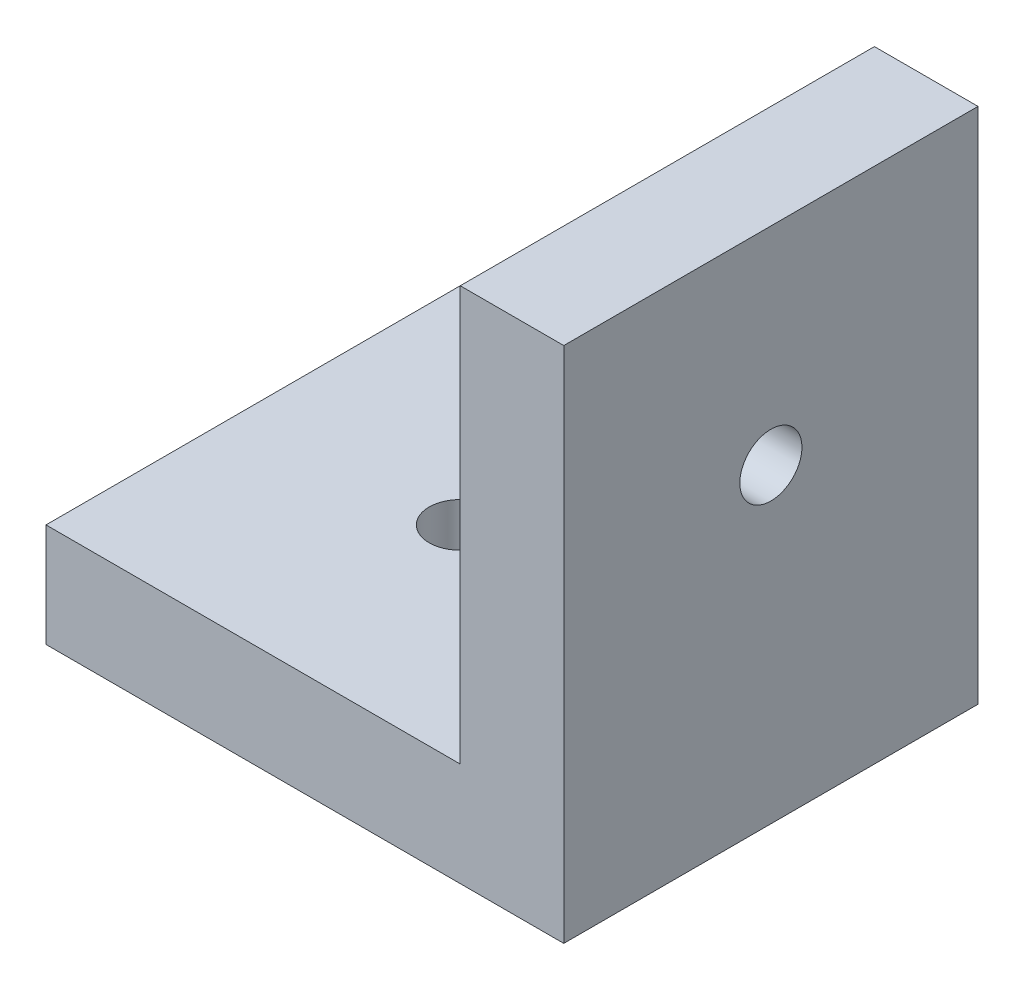
ISO-10303-21;
HEADER;
FILE_DESCRIPTION(('STEP AP214'),'2;1');
FILE_NAME('part.step','',(''),(''),'','','');
FILE_SCHEMA(('AUTOMOTIVE_DESIGN { 1 0 10303 214 1 1 1 1 }'));
ENDSEC;
DATA;
#1=APPLICATION_CONTEXT('core data for automotive mechanical design processes');
#2=APPLICATION_PROTOCOL_DEFINITION('international standard','automotive_design',2000,#1);
#3=PRODUCT_CONTEXT('',#1,'mechanical');
#4=PRODUCT('Part','Part','',(#3));
#5=PRODUCT_RELATED_PRODUCT_CATEGORY('part','',(#4));
#6=PRODUCT_DEFINITION_FORMATION('','',#4);
#7=PRODUCT_DEFINITION_CONTEXT('part definition',#1,'design');
#8=PRODUCT_DEFINITION('design','',#6,#7);
#9=PRODUCT_DEFINITION_SHAPE('','',#8);
#10=(LENGTH_UNIT() NAMED_UNIT(*) SI_UNIT(.MILLI.,.METRE.));
#11=(NAMED_UNIT(*) PLANE_ANGLE_UNIT() SI_UNIT($,.RADIAN.));
#12=(NAMED_UNIT(*) SI_UNIT($,.STERADIAN.) SOLID_ANGLE_UNIT());
#13=UNCERTAINTY_MEASURE_WITH_UNIT(LENGTH_MEASURE(1.E-05),#10,'distance_accuracy_value','');
#14=(GEOMETRIC_REPRESENTATION_CONTEXT(3) GLOBAL_UNCERTAINTY_ASSIGNED_CONTEXT((#13)) GLOBAL_UNIT_ASSIGNED_CONTEXT((#10,
#11,#12)) REPRESENTATION_CONTEXT('',''));
#15=CARTESIAN_POINT('',(0.,0.,0.));
#16=DIRECTION('',(0.,0.,1.));
#17=DIRECTION('',(1.,0.,0.));
#18=AXIS2_PLACEMENT_3D('',#15,#16,#17);
#19=CARTESIAN_POINT('',(0.,0.,20.));
#20=DIRECTION('',(1.,0.,0.));
#21=DIRECTION('',(0.,1.,0.));
#22=AXIS2_PLACEMENT_3D('',#19,#20,#21);
#23=PLANE('',#22);
#24=CARTESIAN_POINT('',(0.,-10.,10.));
#25=DIRECTION('',(-1.,0.,0.));
#26=DIRECTION('',(0.,-1.,0.));
#27=AXIS2_PLACEMENT_3D('',#24,#25,#26);
#28=CIRCLE('',#27,1.5);
#29=CARTESIAN_POINT('',(0.,-11.5,10.));
#30=VERTEX_POINT('',#29);
#31=EDGE_CURVE('E167',#30,#30,#28,.T.);
#32=ORIENTED_EDGE('',*,*,#31,.F.);
#33=EDGE_LOOP('',(#32));
#34=FACE_BOUND('',#33,.T.);
#35=DIRECTION('',(0.,-1.,0.));
#36=VECTOR('',#35,1.);
#37=CARTESIAN_POINT('',(0.,0.,0.));
#38=LINE('',#37,#36);
#39=CARTESIAN_POINT('',(0.,0.,0.));
#40=VERTEX_POINT('',#39);
#41=CARTESIAN_POINT('',(0.,-20.,0.));
#42=VERTEX_POINT('',#41);
#43=EDGE_CURVE('E123',#40,#42,#38,.T.);
#44=ORIENTED_EDGE('',*,*,#43,.T.);
#45=DIRECTION('',(0.,0.,-1.));
#46=VECTOR('',#45,1.);
#47=CARTESIAN_POINT('',(0.,-20.,20.));
#48=LINE('',#47,#46);
#49=CARTESIAN_POINT('',(0.,-20.,20.));
#50=VERTEX_POINT('',#49);
#51=EDGE_CURVE('E11',#50,#42,#48,.T.);
#52=ORIENTED_EDGE('',*,*,#51,.F.);
#53=DIRECTION('',(0.,-1.,0.));
#54=VECTOR('',#53,1.);
#55=CARTESIAN_POINT('',(0.,0.,20.));
#56=LINE('',#55,#54);
#57=CARTESIAN_POINT('',(0.,0.,20.));
#58=VERTEX_POINT('',#57);
#59=EDGE_CURVE('E138',#58,#50,#56,.T.);
#60=ORIENTED_EDGE('',*,*,#59,.F.);
#61=DIRECTION('',(0.,0.,-1.));
#62=VECTOR('',#61,1.);
#63=CARTESIAN_POINT('',(0.,0.,20.));
#64=LINE('',#63,#62);
#65=EDGE_CURVE('E55',#58,#40,#64,.T.);
#66=ORIENTED_EDGE('',*,*,#65,.T.);
#67=EDGE_LOOP('',(#44,#52,#60,#66));
#68=FACE_BOUND('',#67,.T.);
#69=ADVANCED_FACE('F39',(#34,#68),#23,.F.);
#70=CARTESIAN_POINT('',(0.,-20.,20.));
#71=DIRECTION('',(0.,-1.,0.));
#72=DIRECTION('',(1.,0.,0.));
#73=AXIS2_PLACEMENT_3D('',#70,#71,#72);
#74=PLANE('',#73);
#75=CARTESIAN_POINT('',(-10.,-20.,10.));
#76=DIRECTION('',(0.,1.,0.));
#77=DIRECTION('',(-1.,0.,0.));
#78=AXIS2_PLACEMENT_3D('',#75,#76,#77);
#79=CIRCLE('',#78,1.5);
#80=CARTESIAN_POINT('',(-11.5,-20.,10.));
#81=VERTEX_POINT('',#80);
#82=EDGE_CURVE('E173',#81,#81,#79,.T.);
#83=ORIENTED_EDGE('',*,*,#82,.F.);
#84=EDGE_LOOP('',(#83));
#85=FACE_BOUND('',#84,.T.);
#86=DIRECTION('',(-1.,0.,0.));
#87=VECTOR('',#86,1.);
#88=CARTESIAN_POINT('',(0.,-20.,0.));
#89=LINE('',#88,#87);
#90=CARTESIAN_POINT('',(-20.,-20.,0.));
#91=VERTEX_POINT('',#90);
#92=EDGE_CURVE('E125',#42,#91,#89,.T.);
#93=ORIENTED_EDGE('',*,*,#92,.T.);
#94=DIRECTION('',(0.,0.,-1.));
#95=VECTOR('',#94,1.);
#96=CARTESIAN_POINT('',(-20.,-20.,20.));
#97=LINE('',#96,#95);
#98=CARTESIAN_POINT('',(-20.,-20.,20.));
#99=VERTEX_POINT('',#98);
#100=EDGE_CURVE('E47',#99,#91,#97,.T.);
#101=ORIENTED_EDGE('',*,*,#100,.F.);
#102=DIRECTION('',(-1.,0.,0.));
#103=VECTOR('',#102,1.);
#104=CARTESIAN_POINT('',(0.,-20.,20.));
#105=LINE('',#104,#103);
#106=EDGE_CURVE('E87',#50,#99,#105,.T.);
#107=ORIENTED_EDGE('',*,*,#106,.F.);
#108=ORIENTED_EDGE('',*,*,#51,.T.);
#109=EDGE_LOOP('',(#93,#101,#107,#108));
#110=FACE_BOUND('',#109,.T.);
#111=ADVANCED_FACE('F144',(#85,#110),#74,.F.);
#112=CARTESIAN_POINT('',(-20.,0.,20.));
#113=DIRECTION('',(-1.,0.,0.));
#114=DIRECTION('',(0.,0.,1.));
#115=AXIS2_PLACEMENT_3D('',#112,#113,#114);
#116=PLANE('',#115);
#117=DIRECTION('',(0.,1.,0.));
#118=VECTOR('',#117,1.);
#119=CARTESIAN_POINT('',(-20.,0.,0.));
#120=LINE('',#119,#118);
#121=CARTESIAN_POINT('',(-20.,-25.,0.));
#122=VERTEX_POINT('',#121);
#123=EDGE_CURVE('E129',#122,#91,#120,.T.);
#124=ORIENTED_EDGE('',*,*,#123,.F.);
#125=DIRECTION('',(0.,0.,-1.));
#126=VECTOR('',#125,1.);
#127=CARTESIAN_POINT('',(-20.,-25.,20.));
#128=LINE('',#127,#126);
#129=CARTESIAN_POINT('',(-20.,-25.,20.));
#130=VERTEX_POINT('',#129);
#131=EDGE_CURVE('E115',#130,#122,#128,.T.);
#132=ORIENTED_EDGE('',*,*,#131,.F.);
#133=DIRECTION('',(0.,1.,0.));
#134=VECTOR('',#133,1.);
#135=CARTESIAN_POINT('',(-20.,0.,20.));
#136=LINE('',#135,#134);
#137=EDGE_CURVE('E105',#130,#99,#136,.T.);
#138=ORIENTED_EDGE('',*,*,#137,.T.);
#139=ORIENTED_EDGE('',*,*,#100,.T.);
#140=EDGE_LOOP('',(#124,#132,#138,#139));
#141=FACE_BOUND('',#140,.T.);
#142=ADVANCED_FACE('F143',(#141),#116,.T.);
#143=CARTESIAN_POINT('',(0.,-25.,20.));
#144=DIRECTION('',(0.,1.,0.));
#145=DIRECTION('',(0.,0.,1.));
#146=AXIS2_PLACEMENT_3D('',#143,#144,#145);
#147=PLANE('',#146);
#148=CARTESIAN_POINT('',(-10.,-25.,10.));
#149=DIRECTION('',(0.,1.,0.));
#150=DIRECTION('',(0.,0.,1.));
#151=AXIS2_PLACEMENT_3D('',#148,#149,#150);
#152=CIRCLE('',#151,1.5);
#153=CARTESIAN_POINT('',(-10.,-25.,11.5));
#154=VERTEX_POINT('',#153);
#155=EDGE_CURVE('E126',#154,#154,#152,.F.);
#156=ORIENTED_EDGE('',*,*,#155,.F.);
#157=EDGE_LOOP('',(#156));
#158=FACE_BOUND('',#157,.T.);
#159=DIRECTION('',(1.,0.,0.));
#160=VECTOR('',#159,1.);
#161=CARTESIAN_POINT('',(0.,-25.,0.));
#162=LINE('',#161,#160);
#163=CARTESIAN_POINT('',(5.,-25.,0.));
#164=VERTEX_POINT('',#163);
#165=EDGE_CURVE('E112',#122,#164,#162,.T.);
#166=ORIENTED_EDGE('',*,*,#165,.T.);
#167=DIRECTION('',(0.,0.,-1.));
#168=VECTOR('',#167,1.);
#169=CARTESIAN_POINT('',(5.,-25.,20.));
#170=LINE('',#169,#168);
#171=CARTESIAN_POINT('',(5.,-25.,20.));
#172=VERTEX_POINT('',#171);
#173=EDGE_CURVE('E109',#172,#164,#170,.T.);
#174=ORIENTED_EDGE('',*,*,#173,.F.);
#175=DIRECTION('',(1.,0.,0.));
#176=VECTOR('',#175,1.);
#177=CARTESIAN_POINT('',(0.,-25.,20.));
#178=LINE('',#177,#176);
#179=EDGE_CURVE('E98',#130,#172,#178,.T.);
#180=ORIENTED_EDGE('',*,*,#179,.F.);
#181=ORIENTED_EDGE('',*,*,#131,.T.);
#182=EDGE_LOOP('',(#166,#174,#180,#181));
#183=FACE_BOUND('',#182,.T.);
#184=ADVANCED_FACE('F110',(#158,#183),#147,.F.);
#185=CARTESIAN_POINT('',(5.,0.,20.));
#186=DIRECTION('',(1.,0.,0.));
#187=DIRECTION('',(0.,1.,0.));
#188=AXIS2_PLACEMENT_3D('',#185,#186,#187);
#189=PLANE('',#188);
#190=CARTESIAN_POINT('',(5.,-10.,10.));
#191=DIRECTION('',(1.,0.,0.));
#192=DIRECTION('',(0.,1.,0.));
#193=AXIS2_PLACEMENT_3D('',#190,#191,#192);
#194=CIRCLE('',#193,1.5);
#195=CARTESIAN_POINT('',(5.,-11.5,10.));
#196=VERTEX_POINT('',#195);
#197=EDGE_CURVE('E176',#196,#196,#194,.F.);
#198=ORIENTED_EDGE('',*,*,#197,.T.);
#199=EDGE_LOOP('',(#198));
#200=FACE_BOUND('',#199,.T.);
#201=DIRECTION('',(0.,-1.,0.));
#202=VECTOR('',#201,1.);
#203=CARTESIAN_POINT('',(5.,0.,0.));
#204=LINE('',#203,#202);
#205=CARTESIAN_POINT('',(5.,0.,0.));
#206=VERTEX_POINT('',#205);
#207=EDGE_CURVE('E133',#206,#164,#204,.T.);
#208=ORIENTED_EDGE('',*,*,#207,.F.);
#209=DIRECTION('',(0.,0.,-1.));
#210=VECTOR('',#209,1.);
#211=CARTESIAN_POINT('',(5.,0.,20.));
#212=LINE('',#211,#210);
#213=CARTESIAN_POINT('',(5.,0.,20.));
#214=VERTEX_POINT('',#213);
#215=EDGE_CURVE('E75',#214,#206,#212,.T.);
#216=ORIENTED_EDGE('',*,*,#215,.F.);
#217=DIRECTION('',(0.,-1.,0.));
#218=VECTOR('',#217,1.);
#219=CARTESIAN_POINT('',(5.,0.,20.));
#220=LINE('',#219,#218);
#221=EDGE_CURVE('E103',#214,#172,#220,.T.);
#222=ORIENTED_EDGE('',*,*,#221,.T.);
#223=ORIENTED_EDGE('',*,*,#173,.T.);
#224=EDGE_LOOP('',(#208,#216,#222,#223));
#225=FACE_BOUND('',#224,.T.);
#226=ADVANCED_FACE('F117',(#200,#225),#189,.T.);
#227=CARTESIAN_POINT('',(0.,0.,20.));
#228=DIRECTION('',(0.,1.,0.));
#229=DIRECTION('',(0.,0.,1.));
#230=AXIS2_PLACEMENT_3D('',#227,#228,#229);
#231=PLANE('',#230);
#232=DIRECTION('',(1.,0.,0.));
#233=VECTOR('',#232,1.);
#234=CARTESIAN_POINT('',(0.,0.,0.));
#235=LINE('',#234,#233);
#236=EDGE_CURVE('E135',#40,#206,#235,.T.);
#237=ORIENTED_EDGE('',*,*,#236,.F.);
#238=ORIENTED_EDGE('',*,*,#65,.F.);
#239=DIRECTION('',(1.,0.,0.));
#240=VECTOR('',#239,1.);
#241=CARTESIAN_POINT('',(0.,0.,20.));
#242=LINE('',#241,#240);
#243=EDGE_CURVE('E118',#58,#214,#242,.T.);
#244=ORIENTED_EDGE('',*,*,#243,.T.);
#245=ORIENTED_EDGE('',*,*,#215,.T.);
#246=EDGE_LOOP('',(#237,#238,#244,#245));
#247=FACE_BOUND('',#246,.T.);
#248=ADVANCED_FACE('F148',(#247),#231,.T.);
#249=CARTESIAN_POINT('',(0.,0.,20.));
#250=DIRECTION('',(0.,0.,1.));
#251=DIRECTION('',(1.,0.,0.));
#252=AXIS2_PLACEMENT_3D('',#249,#250,#251);
#253=PLANE('',#252);
#254=ORIENTED_EDGE('',*,*,#59,.T.);
#255=ORIENTED_EDGE('',*,*,#106,.T.);
#256=ORIENTED_EDGE('',*,*,#137,.F.);
#257=ORIENTED_EDGE('',*,*,#179,.T.);
#258=ORIENTED_EDGE('',*,*,#221,.F.);
#259=ORIENTED_EDGE('',*,*,#243,.F.);
#260=EDGE_LOOP('',(#254,#255,#256,#257,#258,#259));
#261=FACE_BOUND('',#260,.T.);
#262=ADVANCED_FACE('F100',(#261),#253,.T.);
#263=CARTESIAN_POINT('',(0.,0.,0.));
#264=DIRECTION('',(0.,0.,1.));
#265=DIRECTION('',(1.,0.,0.));
#266=AXIS2_PLACEMENT_3D('',#263,#264,#265);
#267=PLANE('',#266);
#268=ORIENTED_EDGE('',*,*,#43,.F.);
#269=ORIENTED_EDGE('',*,*,#236,.T.);
#270=ORIENTED_EDGE('',*,*,#207,.T.);
#271=ORIENTED_EDGE('',*,*,#165,.F.);
#272=ORIENTED_EDGE('',*,*,#123,.T.);
#273=ORIENTED_EDGE('',*,*,#92,.F.);
#274=EDGE_LOOP('',(#268,#269,#270,#271,#272,#273));
#275=FACE_BOUND('',#274,.T.);
#276=ADVANCED_FACE('F147',(#275),#267,.F.);
#277=CARTESIAN_POINT('',(-10.,-25.001,10.));
#278=DIRECTION('',(0.,1.,0.));
#279=DIRECTION('',(-1.,0.,0.));
#280=AXIS2_PLACEMENT_3D('',#277,#278,#279);
#281=CYLINDRICAL_SURFACE('',#280,1.5);
#282=ORIENTED_EDGE('',*,*,#82,.T.);
#283=EDGE_LOOP('',(#282));
#284=FACE_BOUND('',#283,.T.);
#285=ORIENTED_EDGE('',*,*,#155,.T.);
#286=EDGE_LOOP('',(#285));
#287=FACE_BOUND('',#286,.T.);
#288=ADVANCED_FACE('F182',(#284,#287),#281,.F.);
#289=CARTESIAN_POINT('',(5.001,-10.,10.));
#290=DIRECTION('',(-1.,0.,0.));
#291=DIRECTION('',(0.,-1.,0.));
#292=AXIS2_PLACEMENT_3D('',#289,#290,#291);
#293=CYLINDRICAL_SURFACE('',#292,1.5);
#294=CARTESIAN_POINT('',(5.,-11.5,10.));
#295=CARTESIAN_POINT('',(4.94791666666667,-11.5,10.));
#296=CARTESIAN_POINT('',(4.89583333333334,-11.5,10.));
#297=CARTESIAN_POINT('',(4.79166666666667,-11.5,10.));
#298=CARTESIAN_POINT('',(4.73958333333334,-11.5,10.));
#299=CARTESIAN_POINT('',(4.63541666666667,-11.5,10.));
#300=CARTESIAN_POINT('',(4.58333333333334,-11.5,10.));
#301=CARTESIAN_POINT('',(4.47916666666667,-11.5,10.));
#302=CARTESIAN_POINT('',(4.42708333333334,-11.5,10.));
#303=CARTESIAN_POINT('',(4.32291666666667,-11.5,10.));
#304=CARTESIAN_POINT('',(4.27083333333334,-11.5,10.));
#305=CARTESIAN_POINT('',(4.16666666666667,-11.5,10.));
#306=CARTESIAN_POINT('',(4.11458333333334,-11.5,10.));
#307=CARTESIAN_POINT('',(4.01041666666667,-11.5,10.));
#308=CARTESIAN_POINT('',(3.95833333333334,-11.5,10.));
#309=CARTESIAN_POINT('',(3.85416666666667,-11.5,10.));
#310=CARTESIAN_POINT('',(3.80208333333334,-11.5,10.));
#311=CARTESIAN_POINT('',(3.69791666666667,-11.5,10.));
#312=CARTESIAN_POINT('',(3.64583333333334,-11.5,10.));
#313=CARTESIAN_POINT('',(3.54166666666667,-11.5,10.));
#314=CARTESIAN_POINT('',(3.48958333333334,-11.5,10.));
#315=CARTESIAN_POINT('',(3.38541666666667,-11.5,10.));
#316=CARTESIAN_POINT('',(3.33333333333334,-11.5,10.));
#317=CARTESIAN_POINT('',(3.22916666666667,-11.5,10.));
#318=CARTESIAN_POINT('',(3.17708333333334,-11.5,10.));
#319=CARTESIAN_POINT('',(3.07291666666667,-11.5,10.));
#320=CARTESIAN_POINT('',(3.02083333333334,-11.5,10.));
#321=CARTESIAN_POINT('',(2.91666666666667,-11.5,10.));
#322=CARTESIAN_POINT('',(2.86458333333334,-11.5,10.));
#323=CARTESIAN_POINT('',(2.76041666666667,-11.5,10.));
#324=CARTESIAN_POINT('',(2.70833333333334,-11.5,10.));
#325=CARTESIAN_POINT('',(2.60416666666667,-11.5,10.));
#326=CARTESIAN_POINT('',(2.55208333333334,-11.5,10.));
#327=CARTESIAN_POINT('',(2.44791666666667,-11.5,10.));
#328=CARTESIAN_POINT('',(2.39583333333334,-11.5,10.));
#329=CARTESIAN_POINT('',(2.29166666666667,-11.5,10.));
#330=CARTESIAN_POINT('',(2.23958333333334,-11.5,10.));
#331=CARTESIAN_POINT('',(2.13541666666667,-11.5,10.));
#332=CARTESIAN_POINT('',(2.08333333333334,-11.5,10.));
#333=CARTESIAN_POINT('',(1.97916666666667,-11.5,10.));
#334=CARTESIAN_POINT('',(1.92708333333334,-11.5,10.));
#335=CARTESIAN_POINT('',(1.82291666666667,-11.5,10.));
#336=CARTESIAN_POINT('',(1.77083333333334,-11.5,10.));
#337=CARTESIAN_POINT('',(1.66666666666667,-11.5,10.));
#338=CARTESIAN_POINT('',(1.61458333333334,-11.5,10.));
#339=CARTESIAN_POINT('',(1.51041666666667,-11.5,10.));
#340=CARTESIAN_POINT('',(1.45833333333334,-11.5,10.));
#341=CARTESIAN_POINT('',(1.35416666666667,-11.5,10.));
#342=CARTESIAN_POINT('',(1.30208333333334,-11.5,10.));
#343=CARTESIAN_POINT('',(1.19791666666667,-11.5,10.));
#344=CARTESIAN_POINT('',(1.14583333333334,-11.5,10.));
#345=CARTESIAN_POINT('',(1.04166666666667,-11.5,10.));
#346=CARTESIAN_POINT('',(0.989583333333335,-11.5,10.));
#347=CARTESIAN_POINT('',(0.885416666666668,-11.5,10.));
#348=CARTESIAN_POINT('',(0.833333333333335,-11.5,10.));
#349=CARTESIAN_POINT('',(0.729166666666668,-11.5,10.));
#350=CARTESIAN_POINT('',(0.677083333333335,-11.5,10.));
#351=CARTESIAN_POINT('',(0.572916666666669,-11.5,10.));
#352=CARTESIAN_POINT('',(0.520833333333335,-11.5,10.));
#353=CARTESIAN_POINT('',(0.416666666666669,-11.5,10.));
#354=CARTESIAN_POINT('',(0.364583333333335,-11.5,10.));
#355=CARTESIAN_POINT('',(0.260416666666669,-11.5,10.));
#356=CARTESIAN_POINT('',(0.208333333333335,-11.5,10.));
#357=CARTESIAN_POINT('',(0.104166666666669,-11.5,10.));
#358=CARTESIAN_POINT('',(0.0520833333333352,-11.5,10.));
#359=CARTESIAN_POINT('',(0.,-11.5,10.));
#360=B_SPLINE_CURVE_WITH_KNOTS('',3,(#294,#295,#296,#297,#298,#299,#300,#301,#302,#303,#304,
#305,#306,#307,#308,#309,#310,#311,#312,#313,#314,#315,#316,#317,#318,#319,#320,#321,#322,#323,
#324,#325,#326,#327,#328,#329,#330,#331,#332,#333,#334,#335,#336,#337,#338,#339,#340,#341,#342,
#343,#344,#345,#346,#347,#348,#349,#350,#351,#352,#353,#354,#355,#356,#357,#358,#359),
.UNSPECIFIED.,.F.,.F.,(4,2,2,2,2,2,2,2,2,2,2,2,2,2,2,2,2,2,2,2,2,2,2,2,2,2,2,2,2,2,2,2,4),(0.,
0.156249999999999,0.312499999999999,0.46875,0.625,0.78125,0.9375,1.09375,1.25,1.40625,1.5625,
1.71875,1.875,2.03125,2.1875,2.34375,2.5,2.65625,2.8125,2.96875,3.125,3.28125,3.4375,3.59375,
3.75,3.90625,4.0625,4.21875,4.375,4.53125,4.6875,4.84375,5.),.UNSPECIFIED.);
#361=EDGE_CURVE('BSEAM180',#196,#30,#360,.T.);
#362=ORIENTED_EDGE('',*,*,#197,.F.);
#363=ORIENTED_EDGE('',*,*,#31,.T.);
#364=ORIENTED_EDGE('',*,*,#361,.T.);
#365=ORIENTED_EDGE('',*,*,#361,.F.);
#366=EDGE_LOOP('',(#362,#364,#363,#365));
#367=FACE_BOUND('',#366,.T.);
#368=ADVANCED_FACE('F180',(#367),#293,.F.);
#369=CLOSED_SHELL('',(#69,#111,#142,#184,#226,#248,#262,#276,#288,#368));
#370=MANIFOLD_SOLID_BREP('B2',#369);
#371=ADVANCED_BREP_SHAPE_REPRESENTATION('',(#18,#370),#14);
#372=SHAPE_DEFINITION_REPRESENTATION(#9,#371);
ENDSEC;
END-ISO-10303-21;
